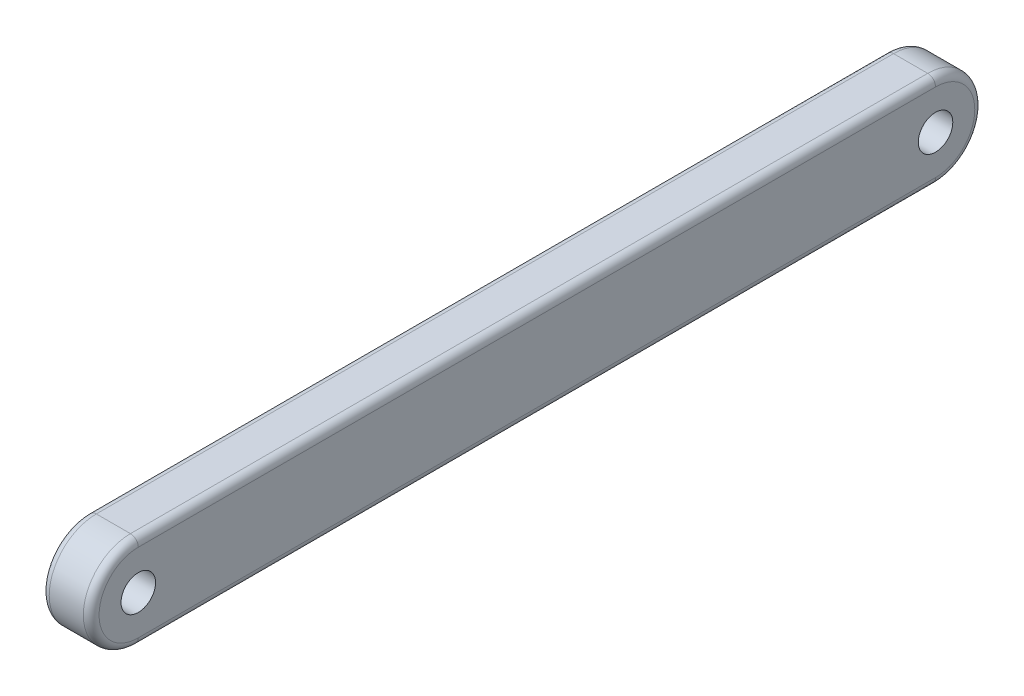
ISO-10303-21;
HEADER;
FILE_DESCRIPTION(('STEP AP214'),'2;1');
FILE_NAME('part.step','',(''),(''),'','','');
FILE_SCHEMA(('AUTOMOTIVE_DESIGN { 1 0 10303 214 1 1 1 1 }'));
ENDSEC;
DATA;
#1=APPLICATION_CONTEXT('core data for automotive mechanical design processes');
#2=APPLICATION_PROTOCOL_DEFINITION('international standard','automotive_design',2000,#1);
#3=PRODUCT_CONTEXT('',#1,'mechanical');
#4=PRODUCT('Part','Part','',(#3));
#5=PRODUCT_RELATED_PRODUCT_CATEGORY('part','',(#4));
#6=PRODUCT_DEFINITION_FORMATION('','',#4);
#7=PRODUCT_DEFINITION_CONTEXT('part definition',#1,'design');
#8=PRODUCT_DEFINITION('design','',#6,#7);
#9=PRODUCT_DEFINITION_SHAPE('','',#8);
#10=(LENGTH_UNIT() NAMED_UNIT(*) SI_UNIT(.MILLI.,.METRE.));
#11=(NAMED_UNIT(*) PLANE_ANGLE_UNIT() SI_UNIT($,.RADIAN.));
#12=(NAMED_UNIT(*) SI_UNIT($,.STERADIAN.) SOLID_ANGLE_UNIT());
#13=UNCERTAINTY_MEASURE_WITH_UNIT(LENGTH_MEASURE(1.E-05),#10,'distance_accuracy_value','');
#14=(GEOMETRIC_REPRESENTATION_CONTEXT(3) GLOBAL_UNCERTAINTY_ASSIGNED_CONTEXT((#13)) GLOBAL_UNIT_ASSIGNED_CONTEXT((#10,
#11,#12)) REPRESENTATION_CONTEXT('',''));
#15=CARTESIAN_POINT('',(0.,0.,0.));
#16=DIRECTION('',(0.,0.,1.));
#17=DIRECTION('',(1.,0.,0.));
#18=AXIS2_PLACEMENT_3D('',#15,#16,#17);
#19=CARTESIAN_POINT('',(6.35,0.,0.));
#20=DIRECTION('',(1.,0.,0.));
#21=DIRECTION('',(0.,0.,-1.));
#22=AXIS2_PLACEMENT_3D('',#19,#20,#21);
#23=PLANE('',#22);
#24=DIRECTION('',(0.,0.,-1.));
#25=VECTOR('',#24,1.);
#26=CARTESIAN_POINT('',(6.35,-5.,-101.6));
#27=LINE('',#26,#25);
#28=CARTESIAN_POINT('',(6.35,-5.,0.));
#29=VERTEX_POINT('',#28);
#30=CARTESIAN_POINT('',(6.35,-5.,-101.6));
#31=VERTEX_POINT('',#30);
#32=EDGE_CURVE('E57',#29,#31,#27,.T.);
#33=ORIENTED_EDGE('',*,*,#32,.T.);
#34=CARTESIAN_POINT('',(6.35,0.,-101.6));
#35=DIRECTION('',(1.,0.,0.));
#36=DIRECTION('',(0.,0.,-1.));
#37=AXIS2_PLACEMENT_3D('',#34,#35,#36);
#38=CIRCLE('',#37,5.);
#39=CARTESIAN_POINT('',(6.35,5.,-101.6));
#40=VERTEX_POINT('',#39);
#41=EDGE_CURVE('E117',#31,#40,#38,.T.);
#42=ORIENTED_EDGE('',*,*,#41,.T.);
#43=DIRECTION('',(0.,0.,1.));
#44=VECTOR('',#43,1.);
#45=CARTESIAN_POINT('',(6.35,5.,0.));
#46=LINE('',#45,#44);
#47=CARTESIAN_POINT('',(6.35,5.,0.));
#48=VERTEX_POINT('',#47);
#49=EDGE_CURVE('E143',#40,#48,#46,.T.);
#50=ORIENTED_EDGE('',*,*,#49,.T.);
#51=CARTESIAN_POINT('',(6.35,0.,0.));
#52=DIRECTION('',(1.,0.,0.));
#53=DIRECTION('',(0.,0.,-1.));
#54=AXIS2_PLACEMENT_3D('',#51,#52,#53);
#55=CIRCLE('',#54,5.);
#56=EDGE_CURVE('E62',#48,#29,#55,.T.);
#57=ORIENTED_EDGE('',*,*,#56,.T.);
#58=EDGE_LOOP('',(#33,#42,#50,#57));
#59=FACE_BOUND('',#58,.T.);
#60=CARTESIAN_POINT('',(6.35,0.,0.));
#61=DIRECTION('',(1.,0.,0.));
#62=DIRECTION('',(0.,0.,-1.));
#63=AXIS2_PLACEMENT_3D('',#60,#61,#62);
#64=CIRCLE('',#63,2.2);
#65=CARTESIAN_POINT('',(6.35,0.,-2.2));
#66=VERTEX_POINT('',#65);
#67=EDGE_CURVE('E190',#66,#66,#64,.T.);
#68=ORIENTED_EDGE('',*,*,#67,.F.);
#69=EDGE_LOOP('',(#68));
#70=FACE_BOUND('',#69,.T.);
#71=CARTESIAN_POINT('',(6.35,0.,-101.6));
#72=DIRECTION('',(1.,0.,0.));
#73=DIRECTION('',(0.,0.,-1.));
#74=AXIS2_PLACEMENT_3D('',#71,#72,#73);
#75=CIRCLE('',#74,2.2);
#76=CARTESIAN_POINT('',(6.35,0.,-103.8));
#77=VERTEX_POINT('',#76);
#78=EDGE_CURVE('E181',#77,#77,#75,.T.);
#79=ORIENTED_EDGE('',*,*,#78,.F.);
#80=EDGE_LOOP('',(#79));
#81=FACE_BOUND('',#80,.T.);
#82=ADVANCED_FACE('F39',(#59,#70,#81),#23,.T.);
#83=CARTESIAN_POINT('',(0.,0.,0.));
#84=DIRECTION('',(1.,0.,0.));
#85=DIRECTION('',(0.,0.,-1.));
#86=AXIS2_PLACEMENT_3D('',#83,#84,#85);
#87=PLANE('',#86);
#88=DIRECTION('',(0.,0.,1.));
#89=VECTOR('',#88,1.);
#90=CARTESIAN_POINT('',(0.,5.,0.));
#91=LINE('',#90,#89);
#92=CARTESIAN_POINT('',(0.,5.,0.));
#93=VERTEX_POINT('',#92);
#94=CARTESIAN_POINT('',(0.,5.,-101.6));
#95=VERTEX_POINT('',#94);
#96=EDGE_CURVE('E206',#93,#95,#91,.F.);
#97=ORIENTED_EDGE('',*,*,#96,.T.);
#98=CARTESIAN_POINT('',(0.,0.,-101.6));
#99=DIRECTION('',(1.,0.,0.));
#100=DIRECTION('',(0.,0.,-1.));
#101=AXIS2_PLACEMENT_3D('',#98,#99,#100);
#102=CIRCLE('',#101,5.);
#103=CARTESIAN_POINT('',(0.,-5.,-101.6));
#104=VERTEX_POINT('',#103);
#105=EDGE_CURVE('E215',#95,#104,#102,.F.);
#106=ORIENTED_EDGE('',*,*,#105,.T.);
#107=DIRECTION('',(0.,0.,-1.));
#108=VECTOR('',#107,1.);
#109=CARTESIAN_POINT('',(0.,-5.,0.));
#110=LINE('',#109,#108);
#111=CARTESIAN_POINT('',(0.,-5.,0.));
#112=VERTEX_POINT('',#111);
#113=EDGE_CURVE('E212',#104,#112,#110,.F.);
#114=ORIENTED_EDGE('',*,*,#113,.T.);
#115=CARTESIAN_POINT('',(0.,0.,0.));
#116=DIRECTION('',(1.,0.,0.));
#117=DIRECTION('',(0.,0.,-1.));
#118=AXIS2_PLACEMENT_3D('',#115,#116,#117);
#119=CIRCLE('',#118,5.);
#120=EDGE_CURVE('E209',#112,#93,#119,.F.);
#121=ORIENTED_EDGE('',*,*,#120,.T.);
#122=EDGE_LOOP('',(#97,#106,#114,#121));
#123=FACE_BOUND('',#122,.T.);
#124=CARTESIAN_POINT('',(0.,0.,0.));
#125=DIRECTION('',(1.,0.,0.));
#126=DIRECTION('',(0.,0.,-1.));
#127=AXIS2_PLACEMENT_3D('',#124,#125,#126);
#128=CIRCLE('',#127,2.2);
#129=CARTESIAN_POINT('',(0.,0.,-2.2));
#130=VERTEX_POINT('',#129);
#131=EDGE_CURVE('E187',#130,#130,#128,.T.);
#132=ORIENTED_EDGE('',*,*,#131,.T.);
#133=EDGE_LOOP('',(#132));
#134=FACE_BOUND('',#133,.T.);
#135=CARTESIAN_POINT('',(0.,0.,-101.6));
#136=DIRECTION('',(1.,0.,0.));
#137=DIRECTION('',(0.,0.,-1.));
#138=AXIS2_PLACEMENT_3D('',#135,#136,#137);
#139=CIRCLE('',#138,2.2);
#140=CARTESIAN_POINT('',(0.,0.,-103.8));
#141=VERTEX_POINT('',#140);
#142=EDGE_CURVE('E174',#141,#141,#139,.T.);
#143=ORIENTED_EDGE('',*,*,#142,.T.);
#144=EDGE_LOOP('',(#143));
#145=FACE_BOUND('',#144,.T.);
#146=ADVANCED_FACE('F264',(#123,#134,#145),#87,.F.);
#147=CARTESIAN_POINT('',(6.35,0.,0.));
#148=DIRECTION('',(-1.,0.,0.));
#149=DIRECTION('',(0.,0.,1.));
#150=AXIS2_PLACEMENT_3D('',#147,#148,#149);
#151=CYLINDRICAL_SURFACE('',#150,6.);
#152=DIRECTION('',(-1.,0.,0.));
#153=VECTOR('',#152,1.);
#154=CARTESIAN_POINT('',(6.35,6.,0.));
#155=LINE('',#154,#153);
#156=CARTESIAN_POINT('',(5.35,6.,0.));
#157=VERTEX_POINT('',#156);
#158=CARTESIAN_POINT('',(1.,6.,0.));
#159=VERTEX_POINT('',#158);
#160=EDGE_CURVE('E111',#157,#159,#155,.T.);
#161=ORIENTED_EDGE('',*,*,#160,.T.);
#162=CARTESIAN_POINT('',(1.,0.,0.));
#163=DIRECTION('',(1.,0.,0.));
#164=DIRECTION('',(0.,0.,-1.));
#165=AXIS2_PLACEMENT_3D('',#162,#163,#164);
#166=CIRCLE('',#165,6.);
#167=CARTESIAN_POINT('',(1.,-6.,0.));
#168=VERTEX_POINT('',#167);
#169=EDGE_CURVE('E228',#159,#168,#166,.T.);
#170=ORIENTED_EDGE('',*,*,#169,.T.);
#171=DIRECTION('',(-1.,0.,0.));
#172=VECTOR('',#171,1.);
#173=CARTESIAN_POINT('',(6.35,-6.,0.));
#174=LINE('',#173,#172);
#175=CARTESIAN_POINT('',(5.35,-6.,0.));
#176=VERTEX_POINT('',#175);
#177=EDGE_CURVE('E140',#176,#168,#174,.T.);
#178=ORIENTED_EDGE('',*,*,#177,.F.);
#179=CARTESIAN_POINT('',(5.35,0.,0.));
#180=DIRECTION('',(1.,0.,0.));
#181=DIRECTION('',(0.,0.,-1.));
#182=AXIS2_PLACEMENT_3D('',#179,#180,#181);
#183=CIRCLE('',#182,6.);
#184=EDGE_CURVE('E225',#176,#157,#183,.F.);
#185=ORIENTED_EDGE('',*,*,#184,.T.);
#186=EDGE_LOOP('',(#161,#170,#178,#185));
#187=FACE_BOUND('',#186,.T.);
#188=ADVANCED_FACE('F246',(#187),#151,.T.);
#189=CARTESIAN_POINT('',(6.35,-6.,0.));
#190=DIRECTION('',(0.,1.,0.));
#191=DIRECTION('',(0.,0.,1.));
#192=AXIS2_PLACEMENT_3D('',#189,#190,#191);
#193=PLANE('',#192);
#194=ORIENTED_EDGE('',*,*,#177,.T.);
#195=DIRECTION('',(0.,0.,-1.));
#196=VECTOR('',#195,1.);
#197=CARTESIAN_POINT('',(1.,-6.,0.));
#198=LINE('',#197,#196);
#199=CARTESIAN_POINT('',(1.,-6.,-101.6));
#200=VERTEX_POINT('',#199);
#201=EDGE_CURVE('E222',#168,#200,#198,.T.);
#202=ORIENTED_EDGE('',*,*,#201,.T.);
#203=DIRECTION('',(-1.,0.,0.));
#204=VECTOR('',#203,1.);
#205=CARTESIAN_POINT('',(6.35,-6.,-101.6));
#206=LINE('',#205,#204);
#207=CARTESIAN_POINT('',(5.35,-6.,-101.6));
#208=VERTEX_POINT('',#207);
#209=EDGE_CURVE('E130',#208,#200,#206,.T.);
#210=ORIENTED_EDGE('',*,*,#209,.F.);
#211=DIRECTION('',(0.,0.,-1.));
#212=VECTOR('',#211,1.);
#213=CARTESIAN_POINT('',(5.35,-6.,0.));
#214=LINE('',#213,#212);
#215=EDGE_CURVE('E219',#208,#176,#214,.F.);
#216=ORIENTED_EDGE('',*,*,#215,.T.);
#217=EDGE_LOOP('',(#194,#202,#210,#216));
#218=FACE_BOUND('',#217,.T.);
#219=ADVANCED_FACE('F244',(#218),#193,.F.);
#220=CARTESIAN_POINT('',(6.35,0.,-101.6));
#221=DIRECTION('',(-1.,0.,0.));
#222=DIRECTION('',(0.,0.,1.));
#223=AXIS2_PLACEMENT_3D('',#220,#221,#222);
#224=CYLINDRICAL_SURFACE('',#223,6.);
#225=ORIENTED_EDGE('',*,*,#209,.T.);
#226=CARTESIAN_POINT('',(1.,0.,-101.6));
#227=DIRECTION('',(1.,0.,0.));
#228=DIRECTION('',(0.,0.,-1.));
#229=AXIS2_PLACEMENT_3D('',#226,#227,#228);
#230=CIRCLE('',#229,6.);
#231=CARTESIAN_POINT('',(1.,6.,-101.6));
#232=VERTEX_POINT('',#231);
#233=EDGE_CURVE('E128',#200,#232,#230,.T.);
#234=ORIENTED_EDGE('',*,*,#233,.T.);
#235=DIRECTION('',(-1.,0.,0.));
#236=VECTOR('',#235,1.);
#237=CARTESIAN_POINT('',(6.35,6.,-101.6));
#238=LINE('',#237,#236);
#239=CARTESIAN_POINT('',(5.35,6.,-101.6));
#240=VERTEX_POINT('',#239);
#241=EDGE_CURVE('E109',#240,#232,#238,.T.);
#242=ORIENTED_EDGE('',*,*,#241,.F.);
#243=CARTESIAN_POINT('',(5.35,0.,-101.6));
#244=DIRECTION('',(1.,0.,0.));
#245=DIRECTION('',(0.,0.,-1.));
#246=AXIS2_PLACEMENT_3D('',#243,#244,#245);
#247=CIRCLE('',#246,6.);
#248=EDGE_CURVE('E125',#240,#208,#247,.F.);
#249=ORIENTED_EDGE('',*,*,#248,.T.);
#250=EDGE_LOOP('',(#225,#234,#242,#249));
#251=FACE_BOUND('',#250,.T.);
#252=ADVANCED_FACE('F124',(#251),#224,.T.);
#253=CARTESIAN_POINT('',(6.35,6.,0.));
#254=DIRECTION('',(0.,-1.,0.));
#255=DIRECTION('',(0.,0.,-1.));
#256=AXIS2_PLACEMENT_3D('',#253,#254,#255);
#257=PLANE('',#256);
#258=ORIENTED_EDGE('',*,*,#241,.T.);
#259=DIRECTION('',(0.,0.,1.));
#260=VECTOR('',#259,1.);
#261=CARTESIAN_POINT('',(1.,6.,0.));
#262=LINE('',#261,#260);
#263=EDGE_CURVE('E11',#232,#159,#262,.T.);
#264=ORIENTED_EDGE('',*,*,#263,.T.);
#265=ORIENTED_EDGE('',*,*,#160,.F.);
#266=DIRECTION('',(0.,0.,1.));
#267=VECTOR('',#266,1.);
#268=CARTESIAN_POINT('',(5.35,6.,-101.6));
#269=LINE('',#268,#267);
#270=EDGE_CURVE('E49',#157,#240,#269,.F.);
#271=ORIENTED_EDGE('',*,*,#270,.T.);
#272=EDGE_LOOP('',(#258,#264,#265,#271));
#273=FACE_BOUND('',#272,.T.);
#274=ADVANCED_FACE('F108',(#273),#257,.F.);
#275=CARTESIAN_POINT('',(6.35,0.,0.));
#276=DIRECTION('',(-1.,0.,0.));
#277=DIRECTION('',(0.,0.,1.));
#278=AXIS2_PLACEMENT_3D('',#275,#276,#277);
#279=CYLINDRICAL_SURFACE('',#278,2.2);
#280=ORIENTED_EDGE('',*,*,#67,.T.);
#281=EDGE_LOOP('',(#280));
#282=FACE_BOUND('',#281,.T.);
#283=ORIENTED_EDGE('',*,*,#131,.F.);
#284=EDGE_LOOP('',(#283));
#285=FACE_BOUND('',#284,.T.);
#286=ADVANCED_FACE('F272',(#282,#285),#279,.F.);
#287=CARTESIAN_POINT('',(6.35,0.,-101.6));
#288=DIRECTION('',(-1.,0.,0.));
#289=DIRECTION('',(0.,0.,1.));
#290=AXIS2_PLACEMENT_3D('',#287,#288,#289);
#291=CYLINDRICAL_SURFACE('',#290,2.2);
#292=ORIENTED_EDGE('',*,*,#78,.T.);
#293=EDGE_LOOP('',(#292));
#294=FACE_BOUND('',#293,.T.);
#295=ORIENTED_EDGE('',*,*,#142,.F.);
#296=EDGE_LOOP('',(#295));
#297=FACE_BOUND('',#296,.T.);
#298=ADVANCED_FACE('F304',(#294,#297),#291,.F.);
#299=CARTESIAN_POINT('',(1.,0.,0.));
#300=DIRECTION('',(1.,0.,0.));
#301=DIRECTION('',(0.,0.,-1.));
#302=AXIS2_PLACEMENT_3D('',#299,#300,#301);
#303=TOROIDAL_SURFACE('',#302,5.,1.);
#304=CARTESIAN_POINT('',(1.,5.,0.));
#305=DIRECTION('',(0.,0.,-1.));
#306=DIRECTION('',(-1.,0.,0.));
#307=AXIS2_PLACEMENT_3D('',#304,#305,#306);
#308=CIRCLE('',#307,1.);
#309=EDGE_CURVE('E165',#93,#159,#308,.T.);
#310=ORIENTED_EDGE('',*,*,#309,.F.);
#311=ORIENTED_EDGE('',*,*,#120,.F.);
#312=CARTESIAN_POINT('',(1.,-5.,0.));
#313=DIRECTION('',(0.,0.,-1.));
#314=DIRECTION('',(-1.,0.,0.));
#315=AXIS2_PLACEMENT_3D('',#312,#313,#314);
#316=CIRCLE('',#315,1.);
#317=EDGE_CURVE('E150',#168,#112,#316,.T.);
#318=ORIENTED_EDGE('',*,*,#317,.F.);
#319=ORIENTED_EDGE('',*,*,#169,.F.);
#320=EDGE_LOOP('',(#310,#311,#318,#319));
#321=FACE_BOUND('',#320,.T.);
#322=ADVANCED_FACE('F249',(#321),#303,.T.);
#323=CARTESIAN_POINT('',(1.,-5.,0.));
#324=DIRECTION('',(0.,0.,-1.));
#325=DIRECTION('',(-1.,0.,0.));
#326=AXIS2_PLACEMENT_3D('',#323,#324,#325);
#327=CYLINDRICAL_SURFACE('',#326,1.);
#328=ORIENTED_EDGE('',*,*,#317,.T.);
#329=ORIENTED_EDGE('',*,*,#113,.F.);
#330=CARTESIAN_POINT('',(1.,-5.,-101.6));
#331=DIRECTION('',(0.,0.,-1.));
#332=DIRECTION('',(-1.,0.,0.));
#333=AXIS2_PLACEMENT_3D('',#330,#331,#332);
#334=CIRCLE('',#333,1.);
#335=EDGE_CURVE('E158',#200,#104,#334,.T.);
#336=ORIENTED_EDGE('',*,*,#335,.F.);
#337=ORIENTED_EDGE('',*,*,#201,.F.);
#338=EDGE_LOOP('',(#328,#329,#336,#337));
#339=FACE_BOUND('',#338,.T.);
#340=ADVANCED_FACE('F252',(#339),#327,.T.);
#341=CARTESIAN_POINT('',(1.,5.,0.));
#342=DIRECTION('',(0.,0.,1.));
#343=DIRECTION('',(1.,0.,0.));
#344=AXIS2_PLACEMENT_3D('',#341,#342,#343);
#345=CYLINDRICAL_SURFACE('',#344,1.);
#346=ORIENTED_EDGE('',*,*,#309,.T.);
#347=ORIENTED_EDGE('',*,*,#263,.F.);
#348=CARTESIAN_POINT('',(1.,5.,-101.6));
#349=DIRECTION('',(0.,0.,-1.));
#350=DIRECTION('',(-1.,0.,0.));
#351=AXIS2_PLACEMENT_3D('',#348,#349,#350);
#352=CIRCLE('',#351,1.);
#353=EDGE_CURVE('E155',#95,#232,#352,.T.);
#354=ORIENTED_EDGE('',*,*,#353,.F.);
#355=ORIENTED_EDGE('',*,*,#96,.F.);
#356=EDGE_LOOP('',(#346,#347,#354,#355));
#357=FACE_BOUND('',#356,.T.);
#358=ADVANCED_FACE('F255',(#357),#345,.T.);
#359=CARTESIAN_POINT('',(1.,0.,-101.6));
#360=DIRECTION('',(1.,0.,0.));
#361=DIRECTION('',(0.,0.,-1.));
#362=AXIS2_PLACEMENT_3D('',#359,#360,#361);
#363=TOROIDAL_SURFACE('',#362,5.,1.);
#364=ORIENTED_EDGE('',*,*,#335,.T.);
#365=ORIENTED_EDGE('',*,*,#105,.F.);
#366=ORIENTED_EDGE('',*,*,#353,.T.);
#367=ORIENTED_EDGE('',*,*,#233,.F.);
#368=EDGE_LOOP('',(#364,#365,#366,#367));
#369=FACE_BOUND('',#368,.T.);
#370=ADVANCED_FACE('F253',(#369),#363,.T.);
#371=CARTESIAN_POINT('',(5.35,0.,0.));
#372=DIRECTION('',(1.,0.,0.));
#373=DIRECTION('',(0.,0.,-1.));
#374=AXIS2_PLACEMENT_3D('',#371,#372,#373);
#375=TOROIDAL_SURFACE('',#374,5.,1.);
#376=CARTESIAN_POINT('',(5.35,5.,0.));
#377=DIRECTION('',(0.,0.,-1.));
#378=DIRECTION('',(-1.,0.,0.));
#379=AXIS2_PLACEMENT_3D('',#376,#377,#378);
#380=CIRCLE('',#379,1.);
#381=EDGE_CURVE('E147',#157,#48,#380,.T.);
#382=ORIENTED_EDGE('',*,*,#381,.F.);
#383=ORIENTED_EDGE('',*,*,#184,.F.);
#384=CARTESIAN_POINT('',(5.35,-5.,0.));
#385=DIRECTION('',(0.,0.,-1.));
#386=DIRECTION('',(-1.,0.,0.));
#387=AXIS2_PLACEMENT_3D('',#384,#385,#386);
#388=CIRCLE('',#387,1.);
#389=EDGE_CURVE('E43',#29,#176,#388,.T.);
#390=ORIENTED_EDGE('',*,*,#389,.F.);
#391=ORIENTED_EDGE('',*,*,#56,.F.);
#392=EDGE_LOOP('',(#382,#383,#390,#391));
#393=FACE_BOUND('',#392,.T.);
#394=ADVANCED_FACE('F41',(#393),#375,.T.);
#395=CARTESIAN_POINT('',(5.35,-5.,0.));
#396=DIRECTION('',(0.,0.,1.));
#397=DIRECTION('',(1.,0.,0.));
#398=AXIS2_PLACEMENT_3D('',#395,#396,#397);
#399=CYLINDRICAL_SURFACE('',#398,1.);
#400=ORIENTED_EDGE('',*,*,#389,.T.);
#401=ORIENTED_EDGE('',*,*,#215,.F.);
#402=CARTESIAN_POINT('',(5.35,-5.,-101.6));
#403=DIRECTION('',(0.,0.,-1.));
#404=DIRECTION('',(-1.,0.,0.));
#405=AXIS2_PLACEMENT_3D('',#402,#403,#404);
#406=CIRCLE('',#405,1.);
#407=EDGE_CURVE('E137',#31,#208,#406,.T.);
#408=ORIENTED_EDGE('',*,*,#407,.F.);
#409=ORIENTED_EDGE('',*,*,#32,.F.);
#410=EDGE_LOOP('',(#400,#401,#408,#409));
#411=FACE_BOUND('',#410,.T.);
#412=ADVANCED_FACE('F241',(#411),#399,.T.);
#413=CARTESIAN_POINT('',(5.35,5.,0.));
#414=DIRECTION('',(0.,0.,-1.));
#415=DIRECTION('',(-1.,0.,0.));
#416=AXIS2_PLACEMENT_3D('',#413,#414,#415);
#417=CYLINDRICAL_SURFACE('',#416,1.);
#418=ORIENTED_EDGE('',*,*,#381,.T.);
#419=ORIENTED_EDGE('',*,*,#49,.F.);
#420=CARTESIAN_POINT('',(5.35,5.,-101.6));
#421=DIRECTION('',(0.,0.,-1.));
#422=DIRECTION('',(-1.,0.,0.));
#423=AXIS2_PLACEMENT_3D('',#420,#421,#422);
#424=CIRCLE('',#423,1.);
#425=EDGE_CURVE('E135',#240,#40,#424,.T.);
#426=ORIENTED_EDGE('',*,*,#425,.F.);
#427=ORIENTED_EDGE('',*,*,#270,.F.);
#428=EDGE_LOOP('',(#418,#419,#426,#427));
#429=FACE_BOUND('',#428,.T.);
#430=ADVANCED_FACE('F142',(#429),#417,.T.);
#431=CARTESIAN_POINT('',(5.35,0.,-101.6));
#432=DIRECTION('',(1.,0.,0.));
#433=DIRECTION('',(0.,0.,-1.));
#434=AXIS2_PLACEMENT_3D('',#431,#432,#433);
#435=TOROIDAL_SURFACE('',#434,5.,1.);
#436=ORIENTED_EDGE('',*,*,#407,.T.);
#437=ORIENTED_EDGE('',*,*,#248,.F.);
#438=ORIENTED_EDGE('',*,*,#425,.T.);
#439=ORIENTED_EDGE('',*,*,#41,.F.);
#440=EDGE_LOOP('',(#436,#437,#438,#439));
#441=FACE_BOUND('',#440,.T.);
#442=ADVANCED_FACE('F133',(#441),#435,.T.);
#443=CLOSED_SHELL('',(#82,#146,#188,#219,#252,#274,#286,#298,#322,#340,#358,#370,#394,#412,#430,#442));
#444=MANIFOLD_SOLID_BREP('B2',#443);
#445=ADVANCED_BREP_SHAPE_REPRESENTATION('',(#18,#444),#14);
#446=SHAPE_DEFINITION_REPRESENTATION(#9,#445);
ENDSEC;
END-ISO-10303-21;
